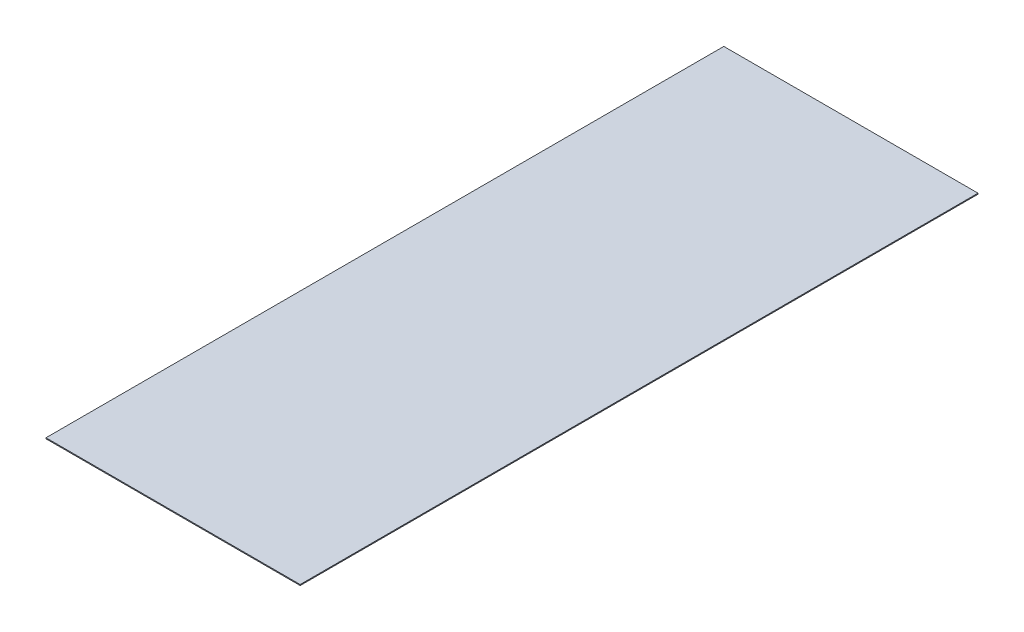
ISO-10303-21;
HEADER;
FILE_DESCRIPTION(('STEP AP214'),'2;1');
FILE_NAME('part.step','',(''),(''),'','','');
FILE_SCHEMA(('AUTOMOTIVE_DESIGN { 1 0 10303 214 1 1 1 1 }'));
ENDSEC;
DATA;
#1=APPLICATION_CONTEXT('core data for automotive mechanical design processes');
#2=APPLICATION_PROTOCOL_DEFINITION('international standard','automotive_design',2000,#1);
#3=PRODUCT_CONTEXT('',#1,'mechanical');
#4=PRODUCT('Part','Part','',(#3));
#5=PRODUCT_RELATED_PRODUCT_CATEGORY('part','',(#4));
#6=PRODUCT_DEFINITION_FORMATION('','',#4);
#7=PRODUCT_DEFINITION_CONTEXT('part definition',#1,'design');
#8=PRODUCT_DEFINITION('design','',#6,#7);
#9=PRODUCT_DEFINITION_SHAPE('','',#8);
#10=(LENGTH_UNIT() NAMED_UNIT(*) SI_UNIT(.MILLI.,.METRE.));
#11=(NAMED_UNIT(*) PLANE_ANGLE_UNIT() SI_UNIT($,.RADIAN.));
#12=(NAMED_UNIT(*) SI_UNIT($,.STERADIAN.) SOLID_ANGLE_UNIT());
#13=UNCERTAINTY_MEASURE_WITH_UNIT(LENGTH_MEASURE(1.E-05),#10,'distance_accuracy_value','');
#14=(GEOMETRIC_REPRESENTATION_CONTEXT(3) GLOBAL_UNCERTAINTY_ASSIGNED_CONTEXT((#13)) GLOBAL_UNIT_ASSIGNED_CONTEXT((#10,
#11,#12)) REPRESENTATION_CONTEXT('',''));
#15=CARTESIAN_POINT('',(0.,0.,0.));
#16=DIRECTION('',(0.,0.,1.));
#17=DIRECTION('',(1.,0.,0.));
#18=AXIS2_PLACEMENT_3D('',#15,#16,#17);
#19=CARTESIAN_POINT('',(457.2,3.4,1219.2));
#20=DIRECTION('',(-1.,0.,0.));
#21=DIRECTION('',(0.,0.,1.));
#22=AXIS2_PLACEMENT_3D('',#19,#20,#21);
#23=PLANE('',#22);
#24=DIRECTION('',(0.,0.,-1.));
#25=VECTOR('',#24,1.);
#26=CARTESIAN_POINT('',(457.2,0.,1219.2));
#27=LINE('',#26,#25);
#28=CARTESIAN_POINT('',(457.2,0.,1219.2));
#29=VERTEX_POINT('',#28);
#30=CARTESIAN_POINT('',(457.2,0.,-1219.2));
#31=VERTEX_POINT('',#30);
#32=EDGE_CURVE('E96',#29,#31,#27,.T.);
#33=ORIENTED_EDGE('',*,*,#32,.T.);
#34=DIRECTION('',(0.,-1.,0.));
#35=VECTOR('',#34,1.);
#36=CARTESIAN_POINT('',(457.2,3.4,-1219.2));
#37=LINE('',#36,#35);
#38=CARTESIAN_POINT('',(457.2,3.4,-1219.2));
#39=VERTEX_POINT('',#38);
#40=EDGE_CURVE('E11',#39,#31,#37,.T.);
#41=ORIENTED_EDGE('',*,*,#40,.F.);
#42=DIRECTION('',(0.,0.,-1.));
#43=VECTOR('',#42,1.);
#44=CARTESIAN_POINT('',(457.2,3.4,1219.2));
#45=LINE('',#44,#43);
#46=CARTESIAN_POINT('',(457.2,3.4,1219.2));
#47=VERTEX_POINT('',#46);
#48=EDGE_CURVE('E84',#47,#39,#45,.T.);
#49=ORIENTED_EDGE('',*,*,#48,.F.);
#50=DIRECTION('',(0.,-1.,0.));
#51=VECTOR('',#50,1.);
#52=CARTESIAN_POINT('',(457.2,3.4,1219.2));
#53=LINE('',#52,#51);
#54=EDGE_CURVE('E92',#47,#29,#53,.T.);
#55=ORIENTED_EDGE('',*,*,#54,.T.);
#56=EDGE_LOOP('',(#33,#41,#49,#55));
#57=FACE_BOUND('',#56,.T.);
#58=ADVANCED_FACE('F33',(#57),#23,.F.);
#59=CARTESIAN_POINT('',(-457.2,3.4,-1219.2));
#60=DIRECTION('',(0.,0.,1.));
#61=DIRECTION('',(1.,0.,0.));
#62=AXIS2_PLACEMENT_3D('',#59,#60,#61);
#63=PLANE('',#62);
#64=DIRECTION('',(-1.,0.,0.));
#65=VECTOR('',#64,1.);
#66=CARTESIAN_POINT('',(-457.2,0.,-1219.2));
#67=LINE('',#66,#65);
#68=CARTESIAN_POINT('',(-457.2,0.,-1219.2));
#69=VERTEX_POINT('',#68);
#70=EDGE_CURVE('E88',#31,#69,#67,.T.);
#71=ORIENTED_EDGE('',*,*,#70,.T.);
#72=DIRECTION('',(0.,-1.,0.));
#73=VECTOR('',#72,1.);
#74=CARTESIAN_POINT('',(-457.2,3.4,-1219.2));
#75=LINE('',#74,#73);
#76=CARTESIAN_POINT('',(-457.2,3.4,-1219.2));
#77=VERTEX_POINT('',#76);
#78=EDGE_CURVE('E41',#77,#69,#75,.T.);
#79=ORIENTED_EDGE('',*,*,#78,.F.);
#80=DIRECTION('',(-1.,0.,0.));
#81=VECTOR('',#80,1.);
#82=CARTESIAN_POINT('',(-457.2,3.4,-1219.2));
#83=LINE('',#82,#81);
#84=EDGE_CURVE('E79',#39,#77,#83,.T.);
#85=ORIENTED_EDGE('',*,*,#84,.F.);
#86=ORIENTED_EDGE('',*,*,#40,.T.);
#87=EDGE_LOOP('',(#71,#79,#85,#86));
#88=FACE_BOUND('',#87,.T.);
#89=ADVANCED_FACE('F87',(#88),#63,.F.);
#90=CARTESIAN_POINT('',(-457.2,3.4,1219.2));
#91=DIRECTION('',(1.,0.,0.));
#92=DIRECTION('',(0.,0.,-1.));
#93=AXIS2_PLACEMENT_3D('',#90,#91,#92);
#94=PLANE('',#93);
#95=DIRECTION('',(0.,0.,1.));
#96=VECTOR('',#95,1.);
#97=CARTESIAN_POINT('',(-457.2,0.,1219.2));
#98=LINE('',#97,#96);
#99=CARTESIAN_POINT('',(-457.2,0.,1219.2));
#100=VERTEX_POINT('',#99);
#101=EDGE_CURVE('E66',#69,#100,#98,.T.);
#102=ORIENTED_EDGE('',*,*,#101,.T.);
#103=DIRECTION('',(0.,-1.,0.));
#104=VECTOR('',#103,1.);
#105=CARTESIAN_POINT('',(-457.2,3.4,1219.2));
#106=LINE('',#105,#104);
#107=CARTESIAN_POINT('',(-457.2,3.4,1219.2));
#108=VERTEX_POINT('',#107);
#109=EDGE_CURVE('E89',#108,#100,#106,.T.);
#110=ORIENTED_EDGE('',*,*,#109,.F.);
#111=DIRECTION('',(0.,0.,1.));
#112=VECTOR('',#111,1.);
#113=CARTESIAN_POINT('',(-457.2,3.4,1219.2));
#114=LINE('',#113,#112);
#115=EDGE_CURVE('E82',#77,#108,#114,.T.);
#116=ORIENTED_EDGE('',*,*,#115,.F.);
#117=ORIENTED_EDGE('',*,*,#78,.T.);
#118=EDGE_LOOP('',(#102,#110,#116,#117));
#119=FACE_BOUND('',#118,.T.);
#120=ADVANCED_FACE('F90',(#119),#94,.F.);
#121=CARTESIAN_POINT('',(-457.2,3.4,1219.2));
#122=DIRECTION('',(0.,0.,-1.));
#123=DIRECTION('',(-1.,0.,0.));
#124=AXIS2_PLACEMENT_3D('',#121,#122,#123);
#125=PLANE('',#124);
#126=DIRECTION('',(1.,0.,0.));
#127=VECTOR('',#126,1.);
#128=CARTESIAN_POINT('',(-457.2,0.,1219.2));
#129=LINE('',#128,#127);
#130=EDGE_CURVE('E72',#100,#29,#129,.T.);
#131=ORIENTED_EDGE('',*,*,#130,.T.);
#132=ORIENTED_EDGE('',*,*,#54,.F.);
#133=DIRECTION('',(1.,0.,0.));
#134=VECTOR('',#133,1.);
#135=CARTESIAN_POINT('',(-457.2,3.4,1219.2));
#136=LINE('',#135,#134);
#137=EDGE_CURVE('E49',#108,#47,#136,.T.);
#138=ORIENTED_EDGE('',*,*,#137,.F.);
#139=ORIENTED_EDGE('',*,*,#109,.T.);
#140=EDGE_LOOP('',(#131,#132,#138,#139));
#141=FACE_BOUND('',#140,.T.);
#142=ADVANCED_FACE('F103',(#141),#125,.F.);
#143=CARTESIAN_POINT('',(0.,3.4,0.));
#144=DIRECTION('',(0.,-1.,0.));
#145=DIRECTION('',(0.,0.,-1.));
#146=AXIS2_PLACEMENT_3D('',#143,#144,#145);
#147=PLANE('',#146);
#148=ORIENTED_EDGE('',*,*,#48,.T.);
#149=ORIENTED_EDGE('',*,*,#84,.T.);
#150=ORIENTED_EDGE('',*,*,#115,.T.);
#151=ORIENTED_EDGE('',*,*,#137,.T.);
#152=EDGE_LOOP('',(#148,#149,#150,#151));
#153=FACE_BOUND('',#152,.T.);
#154=ADVANCED_FACE('F80',(#153),#147,.F.);
#155=CARTESIAN_POINT('',(0.,0.,0.));
#156=DIRECTION('',(0.,-1.,0.));
#157=DIRECTION('',(0.,0.,-1.));
#158=AXIS2_PLACEMENT_3D('',#155,#156,#157);
#159=PLANE('',#158);
#160=ORIENTED_EDGE('',*,*,#32,.F.);
#161=ORIENTED_EDGE('',*,*,#130,.F.);
#162=ORIENTED_EDGE('',*,*,#101,.F.);
#163=ORIENTED_EDGE('',*,*,#70,.F.);
#164=EDGE_LOOP('',(#160,#161,#162,#163));
#165=FACE_BOUND('',#164,.T.);
#166=ADVANCED_FACE('F106',(#165),#159,.T.);
#167=CLOSED_SHELL('',(#58,#89,#120,#142,#154,#166));
#168=MANIFOLD_SOLID_BREP('B2',#167);
#169=ADVANCED_BREP_SHAPE_REPRESENTATION('',(#18,#168),#14);
#170=SHAPE_DEFINITION_REPRESENTATION(#9,#169);
ENDSEC;
END-ISO-10303-21;
